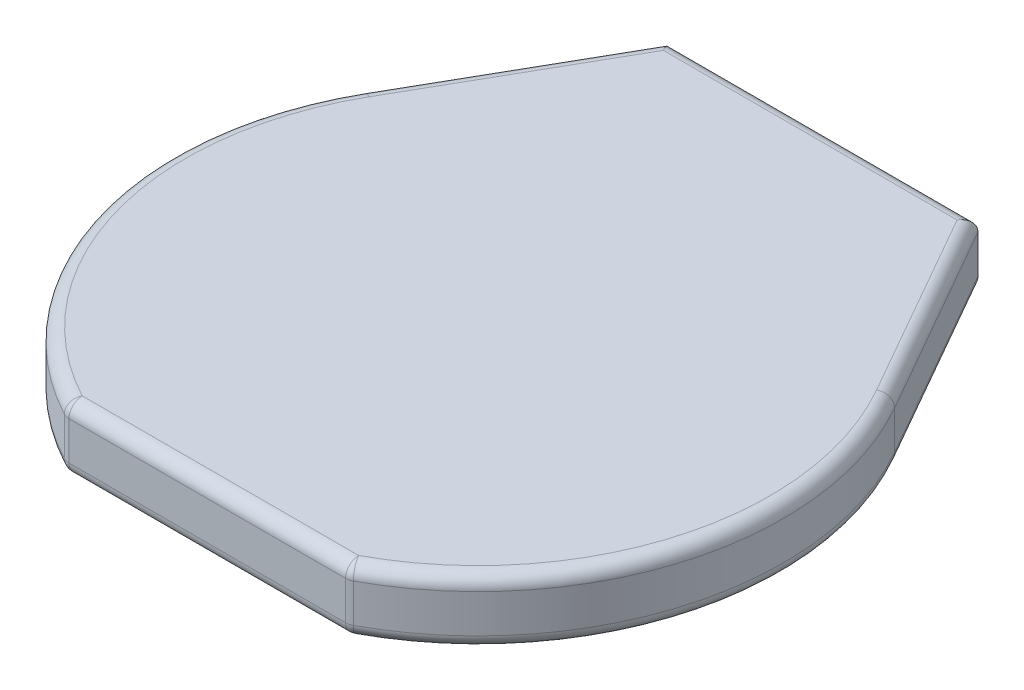
ISO-10303-21;
HEADER;
FILE_DESCRIPTION(('STEP AP214'),'2;1');
FILE_NAME('part.step','',(''),(''),'','','');
FILE_SCHEMA(('AUTOMOTIVE_DESIGN { 1 0 10303 214 1 1 1 1 }'));
ENDSEC;
DATA;
#1=APPLICATION_CONTEXT('core data for automotive mechanical design processes');
#2=APPLICATION_PROTOCOL_DEFINITION('international standard','automotive_design',2000,#1);
#3=PRODUCT_CONTEXT('',#1,'mechanical');
#4=PRODUCT('Part','Part','',(#3));
#5=PRODUCT_RELATED_PRODUCT_CATEGORY('part','',(#4));
#6=PRODUCT_DEFINITION_FORMATION('','',#4);
#7=PRODUCT_DEFINITION_CONTEXT('part definition',#1,'design');
#8=PRODUCT_DEFINITION('design','',#6,#7);
#9=PRODUCT_DEFINITION_SHAPE('','',#8);
#10=(LENGTH_UNIT() NAMED_UNIT(*) SI_UNIT(.MILLI.,.METRE.));
#11=(NAMED_UNIT(*) PLANE_ANGLE_UNIT() SI_UNIT($,.RADIAN.));
#12=(NAMED_UNIT(*) SI_UNIT($,.STERADIAN.) SOLID_ANGLE_UNIT());
#13=UNCERTAINTY_MEASURE_WITH_UNIT(LENGTH_MEASURE(1.E-05),#10,'distance_accuracy_value','');
#14=(GEOMETRIC_REPRESENTATION_CONTEXT(3) GLOBAL_UNCERTAINTY_ASSIGNED_CONTEXT((#13)) GLOBAL_UNIT_ASSIGNED_CONTEXT((#10,
#11,#12)) REPRESENTATION_CONTEXT('',''));
#15=CARTESIAN_POINT('',(0.,0.,0.));
#16=DIRECTION('',(0.,0.,1.));
#17=DIRECTION('',(1.,0.,0.));
#18=AXIS2_PLACEMENT_3D('',#15,#16,#17);
#19=CARTESIAN_POINT('',(0.,3.68,0.));
#20=DIRECTION('',(0.,-1.,0.));
#21=DIRECTION('',(0.,0.,-1.));
#22=AXIS2_PLACEMENT_3D('',#19,#20,#21);
#23=CYLINDRICAL_SURFACE('',#22,17.35);
#24=DIRECTION('',(0.,-1.,0.));
#25=VECTOR('',#24,1.);
#26=CARTESIAN_POINT('',(-15.0708365008925,3.68,-8.5960681223083));
#27=LINE('',#26,#25);
#28=CARTESIAN_POINT('',(-15.0708365008925,2.93,-8.5960681223083));
#29=VERTEX_POINT('',#28);
#30=CARTESIAN_POINT('',(-15.0708365008925,0.75,-8.5960681223083));
#31=VERTEX_POINT('',#30);
#32=EDGE_CURVE('E133',#29,#31,#27,.T.);
#33=ORIENTED_EDGE('',*,*,#32,.T.);
#34=CARTESIAN_POINT('',(0.,0.75,0.));
#35=DIRECTION('',(0.,1.,0.));
#36=DIRECTION('',(0.,0.,1.));
#37=AXIS2_PLACEMENT_3D('',#34,#35,#36);
#38=CIRCLE('',#37,17.35);
#39=CARTESIAN_POINT('',(-8.2084042192336,0.75,15.2854375198641));
#40=VERTEX_POINT('',#39);
#41=EDGE_CURVE('E50',#31,#40,#38,.T.);
#42=ORIENTED_EDGE('',*,*,#41,.T.);
#43=DIRECTION('',(0.,-1.,0.));
#44=VECTOR('',#43,1.);
#45=CARTESIAN_POINT('',(-8.2084042192336,3.68,15.2854375198641));
#46=LINE('',#45,#44);
#47=CARTESIAN_POINT('',(-8.2084042192336,2.93,15.2854375198641));
#48=VERTEX_POINT('',#47);
#49=EDGE_CURVE('E54',#40,#48,#46,.F.);
#50=ORIENTED_EDGE('',*,*,#49,.T.);
#51=CARTESIAN_POINT('',(0.,2.93,0.));
#52=DIRECTION('',(0.,1.,0.));
#53=DIRECTION('',(0.,0.,1.));
#54=AXIS2_PLACEMENT_3D('',#51,#52,#53);
#55=CIRCLE('',#54,17.35);
#56=EDGE_CURVE('E131',#48,#29,#55,.F.);
#57=ORIENTED_EDGE('',*,*,#56,.T.);
#58=EDGE_LOOP('',(#33,#42,#50,#57));
#59=FACE_BOUND('',#58,.T.);
#60=ADVANCED_FACE('F33',(#59),#23,.T.);
#61=CARTESIAN_POINT('',(-8.04,3.68,15.3746837365846));
#62=DIRECTION('',(0.,0.,-1.));
#63=DIRECTION('',(-1.,0.,0.));
#64=AXIS2_PLACEMENT_3D('',#61,#62,#63);
#65=PLANE('',#64);
#66=DIRECTION('',(0.,-1.,0.));
#67=VECTOR('',#66,1.);
#68=CARTESIAN_POINT('',(-7.85357406566442,3.68,15.3746837365846));
#69=LINE('',#68,#67);
#70=CARTESIAN_POINT('',(-7.85357406566442,2.93,15.3746837365846));
#71=VERTEX_POINT('',#70);
#72=CARTESIAN_POINT('',(-7.85357406566442,0.75,15.3746837365846));
#73=VERTEX_POINT('',#72);
#74=EDGE_CURVE('E205',#71,#73,#69,.T.);
#75=ORIENTED_EDGE('',*,*,#74,.T.);
#76=DIRECTION('',(1.,0.,0.));
#77=VECTOR('',#76,1.);
#78=CARTESIAN_POINT('',(-8.04,0.75,15.3746837365846));
#79=LINE('',#78,#77);
#80=CARTESIAN_POINT('',(7.85357406566442,0.75,15.3746837365846));
#81=VERTEX_POINT('',#80);
#82=EDGE_CURVE('E138',#73,#81,#79,.T.);
#83=ORIENTED_EDGE('',*,*,#82,.T.);
#84=DIRECTION('',(0.,-1.,0.));
#85=VECTOR('',#84,1.);
#86=CARTESIAN_POINT('',(7.85357406566442,3.68,15.3746837365846));
#87=LINE('',#86,#85);
#88=CARTESIAN_POINT('',(7.85357406566442,2.93,15.3746837365846));
#89=VERTEX_POINT('',#88);
#90=EDGE_CURVE('E199',#81,#89,#87,.F.);
#91=ORIENTED_EDGE('',*,*,#90,.T.);
#92=DIRECTION('',(1.,0.,0.));
#93=VECTOR('',#92,1.);
#94=CARTESIAN_POINT('',(-8.04,2.93,15.3746837365846));
#95=LINE('',#94,#93);
#96=EDGE_CURVE('E196',#89,#71,#95,.F.);
#97=ORIENTED_EDGE('',*,*,#96,.T.);
#98=EDGE_LOOP('',(#75,#83,#91,#97));
#99=FACE_BOUND('',#98,.T.);
#100=ADVANCED_FACE('F265',(#99),#65,.F.);
#101=CARTESIAN_POINT('',(0.,3.68,0.));
#102=DIRECTION('',(0.,-1.,0.));
#103=DIRECTION('',(0.,0.,-1.));
#104=AXIS2_PLACEMENT_3D('',#101,#102,#103);
#105=CYLINDRICAL_SURFACE('',#104,17.35);
#106=DIRECTION('',(0.,-1.,0.));
#107=VECTOR('',#106,1.);
#108=CARTESIAN_POINT('',(8.2084042192336,3.68,15.2854375198641));
#109=LINE('',#108,#107);
#110=CARTESIAN_POINT('',(8.2084042192336,2.93,15.2854375198641));
#111=VERTEX_POINT('',#110);
#112=CARTESIAN_POINT('',(8.2084042192336,0.75,15.2854375198641));
#113=VERTEX_POINT('',#112);
#114=EDGE_CURVE('E254',#111,#113,#109,.T.);
#115=ORIENTED_EDGE('',*,*,#114,.T.);
#116=CARTESIAN_POINT('',(0.,0.75,0.));
#117=DIRECTION('',(0.,1.,0.));
#118=DIRECTION('',(0.,0.,1.));
#119=AXIS2_PLACEMENT_3D('',#116,#117,#118);
#120=CIRCLE('',#119,17.35);
#121=CARTESIAN_POINT('',(15.0708365008925,0.75,-8.5960681223083));
#122=VERTEX_POINT('',#121);
#123=EDGE_CURVE('E282',#113,#122,#120,.T.);
#124=ORIENTED_EDGE('',*,*,#123,.T.);
#125=DIRECTION('',(0.,-1.,0.));
#126=VECTOR('',#125,1.);
#127=CARTESIAN_POINT('',(15.0708365008925,3.68,-8.5960681223083));
#128=LINE('',#127,#126);
#129=CARTESIAN_POINT('',(15.0708365008925,2.93,-8.5960681223083));
#130=VERTEX_POINT('',#129);
#131=EDGE_CURVE('E160',#130,#122,#128,.T.);
#132=ORIENTED_EDGE('',*,*,#131,.F.);
#133=CARTESIAN_POINT('',(0.,2.93,0.));
#134=DIRECTION('',(0.,1.,0.));
#135=DIRECTION('',(0.,0.,1.));
#136=AXIS2_PLACEMENT_3D('',#133,#134,#135);
#137=CIRCLE('',#136,17.35);
#138=EDGE_CURVE('E290',#130,#111,#137,.F.);
#139=ORIENTED_EDGE('',*,*,#138,.T.);
#140=EDGE_LOOP('',(#115,#124,#132,#139));
#141=FACE_BOUND('',#140,.T.);
#142=ADVANCED_FACE('F352',(#141),#105,.T.);
#143=CARTESIAN_POINT('',(8.78,3.68,-19.6253162634154));
#144=DIRECTION('',(-0.86863610956153,0.,0.49545061223679));
#145=DIRECTION('',(0.49545061223679,0.,0.86863610956153));
#146=AXIS2_PLACEMENT_3D('',#143,#144,#145);
#147=PLANE('',#146);
#148=DIRECTION('',(0.,-1.,0.));
#149=VECTOR('',#148,1.);
#150=CARTESIAN_POINT('',(8.78,3.68,-19.6253162634154));
#151=LINE('',#150,#149);
#152=CARTESIAN_POINT('',(8.78,2.93,-19.6253162634154));
#153=VERTEX_POINT('',#152);
#154=CARTESIAN_POINT('',(8.78,0.75,-19.6253162634154));
#155=VERTEX_POINT('',#154);
#156=EDGE_CURVE('E316',#153,#155,#151,.T.);
#157=ORIENTED_EDGE('',*,*,#156,.F.);
#158=DIRECTION('',(-0.49545061223679,0.,-0.86863610956153));
#159=VECTOR('',#158,1.);
#160=CARTESIAN_POINT('',(15.0708365008925,2.93,-8.5960681223083));
#161=LINE('',#160,#159);
#162=EDGE_CURVE('E191',#153,#130,#161,.F.);
#163=ORIENTED_EDGE('',*,*,#162,.T.);
#164=ORIENTED_EDGE('',*,*,#131,.T.);
#165=DIRECTION('',(-0.49545061223679,0.,-0.86863610956153));
#166=VECTOR('',#165,1.);
#167=CARTESIAN_POINT('',(8.78,0.75,-19.6253162634154));
#168=LINE('',#167,#166);
#169=EDGE_CURVE('E197',#122,#155,#168,.T.);
#170=ORIENTED_EDGE('',*,*,#169,.T.);
#171=EDGE_LOOP('',(#157,#163,#164,#170));
#172=FACE_BOUND('',#171,.T.);
#173=ADVANCED_FACE('F513',(#172),#147,.F.);
#174=CARTESIAN_POINT('',(-8.78,3.68,-19.6253162634154));
#175=DIRECTION('',(0.,0.,1.));
#176=DIRECTION('',(1.,0.,0.));
#177=AXIS2_PLACEMENT_3D('',#174,#175,#176);
#178=PLANE('',#177);
#179=ORIENTED_EDGE('',*,*,#156,.T.);
#180=DIRECTION('',(-1.,0.,0.));
#181=VECTOR('',#180,1.);
#182=CARTESIAN_POINT('',(-8.78,0.75,-19.6253162634154));
#183=LINE('',#182,#181);
#184=CARTESIAN_POINT('',(-8.78,0.75,-19.6253162634154));
#185=VERTEX_POINT('',#184);
#186=EDGE_CURVE('E11',#155,#185,#183,.T.);
#187=ORIENTED_EDGE('',*,*,#186,.T.);
#188=DIRECTION('',(0.,-1.,0.));
#189=VECTOR('',#188,1.);
#190=CARTESIAN_POINT('',(-8.78,3.68,-19.6253162634154));
#191=LINE('',#190,#189);
#192=CARTESIAN_POINT('',(-8.78,2.93,-19.6253162634154));
#193=VERTEX_POINT('',#192);
#194=EDGE_CURVE('E149',#193,#185,#191,.T.);
#195=ORIENTED_EDGE('',*,*,#194,.F.);
#196=DIRECTION('',(-1.,0.,0.));
#197=VECTOR('',#196,1.);
#198=CARTESIAN_POINT('',(8.78,2.93,-19.6253162634154));
#199=LINE('',#198,#197);
#200=EDGE_CURVE('E42',#193,#153,#199,.F.);
#201=ORIENTED_EDGE('',*,*,#200,.T.);
#202=EDGE_LOOP('',(#179,#187,#195,#201));
#203=FACE_BOUND('',#202,.T.);
#204=ADVANCED_FACE('F505',(#203),#178,.F.);
#205=CARTESIAN_POINT('',(-8.78,3.68,-19.6253162634154));
#206=DIRECTION('',(0.86863610956153,0.,0.49545061223679));
#207=DIRECTION('',(0.49545061223679,0.,-0.86863610956153));
#208=AXIS2_PLACEMENT_3D('',#205,#206,#207);
#209=PLANE('',#208);
#210=ORIENTED_EDGE('',*,*,#194,.T.);
#211=DIRECTION('',(-0.49545061223679,0.,0.86863610956153));
#212=VECTOR('',#211,1.);
#213=CARTESIAN_POINT('',(-8.78,0.75,-19.6253162634154));
#214=LINE('',#213,#212);
#215=EDGE_CURVE('E148',#185,#31,#214,.T.);
#216=ORIENTED_EDGE('',*,*,#215,.T.);
#217=ORIENTED_EDGE('',*,*,#32,.F.);
#218=DIRECTION('',(-0.49545061223679,0.,0.86863610956153));
#219=VECTOR('',#218,1.);
#220=CARTESIAN_POINT('',(-8.78,2.93,-19.6253162634154));
#221=LINE('',#220,#219);
#222=EDGE_CURVE('E145',#29,#193,#221,.F.);
#223=ORIENTED_EDGE('',*,*,#222,.T.);
#224=EDGE_LOOP('',(#210,#216,#217,#223));
#225=FACE_BOUND('',#224,.T.);
#226=ADVANCED_FACE('F144',(#225),#209,.F.);
#227=CARTESIAN_POINT('',(0.,3.68,0.));
#228=DIRECTION('',(0.,1.,0.));
#229=DIRECTION('',(0.,0.,1.));
#230=AXIS2_PLACEMENT_3D('',#227,#228,#229);
#231=PLANE('',#230);
#232=DIRECTION('',(-0.49545061223679,0.,-0.86863610956153));
#233=VECTOR('',#232,1.);
#234=CARTESIAN_POINT('',(8.12852291782885,3.68,-19.2537283042378));
#235=LINE('',#234,#233);
#236=CARTESIAN_POINT('',(14.4193594187214,3.68,-8.22448016313071));
#237=VERTEX_POINT('',#236);
#238=CARTESIAN_POINT('',(8.34436068376961,3.68,-18.8753162634154));
#239=VERTEX_POINT('',#238);
#240=EDGE_CURVE('E190',#237,#239,#235,.T.);
#241=ORIENTED_EDGE('',*,*,#240,.T.);
#242=DIRECTION('',(-1.,0.,0.));
#243=VECTOR('',#242,1.);
#244=CARTESIAN_POINT('',(-8.78,3.68,-18.8753162634154));
#245=LINE('',#244,#243);
#246=CARTESIAN_POINT('',(-8.34436068376961,3.68,-18.8753162634154));
#247=VERTEX_POINT('',#246);
#248=EDGE_CURVE('E186',#239,#247,#245,.T.);
#249=ORIENTED_EDGE('',*,*,#248,.T.);
#250=DIRECTION('',(-0.49545061223679,0.,0.86863610956153));
#251=VECTOR('',#250,1.);
#252=CARTESIAN_POINT('',(-14.4193594187214,3.68,-8.22448016313071));
#253=LINE('',#252,#251);
#254=CARTESIAN_POINT('',(-14.4193594187214,3.68,-8.22448016313071));
#255=VERTEX_POINT('',#254);
#256=EDGE_CURVE('E297',#247,#255,#253,.T.);
#257=ORIENTED_EDGE('',*,*,#256,.T.);
#258=CARTESIAN_POINT('',(0.,3.68,0.));
#259=DIRECTION('',(0.,1.,0.));
#260=DIRECTION('',(0.,0.,1.));
#261=AXIS2_PLACEMENT_3D('',#258,#259,#260);
#262=CIRCLE('',#261,16.6);
#263=CARTESIAN_POINT('',(-7.85357406566443,3.68,14.6246837365846));
#264=VERTEX_POINT('',#263);
#265=EDGE_CURVE('E163',#255,#264,#262,.T.);
#266=ORIENTED_EDGE('',*,*,#265,.T.);
#267=DIRECTION('',(1.,0.,0.));
#268=VECTOR('',#267,1.);
#269=CARTESIAN_POINT('',(8.04,3.68,14.6246837365846));
#270=LINE('',#269,#268);
#271=CARTESIAN_POINT('',(7.85357406566443,3.68,14.6246837365846));
#272=VERTEX_POINT('',#271);
#273=EDGE_CURVE('E288',#264,#272,#270,.T.);
#274=ORIENTED_EDGE('',*,*,#273,.T.);
#275=CARTESIAN_POINT('',(0.,3.68,0.));
#276=DIRECTION('',(0.,1.,0.));
#277=DIRECTION('',(0.,0.,1.));
#278=AXIS2_PLACEMENT_3D('',#275,#276,#277);
#279=CIRCLE('',#278,16.6);
#280=EDGE_CURVE('E286',#272,#237,#279,.T.);
#281=ORIENTED_EDGE('',*,*,#280,.T.);
#282=EDGE_LOOP('',(#241,#249,#257,#266,#274,#281));
#283=FACE_BOUND('',#282,.T.);
#284=ADVANCED_FACE('F299',(#283),#231,.T.);
#285=CARTESIAN_POINT('',(0.,0.,0.));
#286=DIRECTION('',(0.,1.,0.));
#287=DIRECTION('',(0.,0.,1.));
#288=AXIS2_PLACEMENT_3D('',#285,#286,#287);
#289=PLANE('',#288);
#290=DIRECTION('',(1.,0.,0.));
#291=VECTOR('',#290,1.);
#292=CARTESIAN_POINT('',(0.,0.,14.6246837365846));
#293=LINE('',#292,#291);
#294=CARTESIAN_POINT('',(7.85357406566443,0.,14.6246837365846));
#295=VERTEX_POINT('',#294);
#296=CARTESIAN_POINT('',(-7.85357406566443,0.,14.6246837365846));
#297=VERTEX_POINT('',#296);
#298=EDGE_CURVE('E274',#295,#297,#293,.F.);
#299=ORIENTED_EDGE('',*,*,#298,.T.);
#300=CARTESIAN_POINT('',(0.,0.,0.));
#301=DIRECTION('',(0.,1.,0.));
#302=DIRECTION('',(0.,0.,1.));
#303=AXIS2_PLACEMENT_3D('',#300,#301,#302);
#304=CIRCLE('',#303,16.6);
#305=CARTESIAN_POINT('',(-14.4193594187214,0.,-8.22448016313071));
#306=VERTEX_POINT('',#305);
#307=EDGE_CURVE('E301',#297,#306,#304,.F.);
#308=ORIENTED_EDGE('',*,*,#307,.T.);
#309=DIRECTION('',(-0.49545061223679,0.,0.86863610956153));
#310=VECTOR('',#309,1.);
#311=CARTESIAN_POINT('',(-14.4193594187214,0.,-8.22448016313071));
#312=LINE('',#311,#310);
#313=CARTESIAN_POINT('',(-8.34436068376961,0.,-18.8753162634154));
#314=VERTEX_POINT('',#313);
#315=EDGE_CURVE('E305',#306,#314,#312,.F.);
#316=ORIENTED_EDGE('',*,*,#315,.T.);
#317=DIRECTION('',(-1.,0.,0.));
#318=VECTOR('',#317,1.);
#319=CARTESIAN_POINT('',(0.,0.,-18.8753162634154));
#320=LINE('',#319,#318);
#321=CARTESIAN_POINT('',(8.34436068376961,0.,-18.8753162634154));
#322=VERTEX_POINT('',#321);
#323=EDGE_CURVE('E310',#314,#322,#320,.F.);
#324=ORIENTED_EDGE('',*,*,#323,.T.);
#325=DIRECTION('',(-0.49545061223679,0.,-0.86863610956153));
#326=VECTOR('',#325,1.);
#327=CARTESIAN_POINT('',(14.4193594187214,0.,-8.2244801631307));
#328=LINE('',#327,#326);
#329=CARTESIAN_POINT('',(14.4193594187214,0.,-8.22448016313071));
#330=VERTEX_POINT('',#329);
#331=EDGE_CURVE('E312',#322,#330,#328,.F.);
#332=ORIENTED_EDGE('',*,*,#331,.T.);
#333=CARTESIAN_POINT('',(0.,0.,0.));
#334=DIRECTION('',(0.,1.,0.));
#335=DIRECTION('',(0.,0.,1.));
#336=AXIS2_PLACEMENT_3D('',#333,#334,#335);
#337=CIRCLE('',#336,16.6);
#338=EDGE_CURVE('E308',#330,#295,#337,.F.);
#339=ORIENTED_EDGE('',*,*,#338,.T.);
#340=EDGE_LOOP('',(#299,#308,#316,#324,#332,#339));
#341=FACE_BOUND('',#340,.T.);
#342=ADVANCED_FACE('F483',(#341),#289,.F.);
#343=CARTESIAN_POINT('',(14.4193594187214,2.93,-8.22448016313071));
#344=DIRECTION('',(0.49545061223679,0.,0.86863610956153));
#345=DIRECTION('',(0.86863610956153,0.,-0.49545061223679));
#346=AXIS2_PLACEMENT_3D('',#343,#344,#345);
#347=CYLINDRICAL_SURFACE('',#346,0.75);
#348=CARTESIAN_POINT('',(14.4193594187214,2.93,-8.22448016313071));
#349=DIRECTION('',(0.49545061223679,0.,0.86863610956153));
#350=DIRECTION('',(0.86863610956153,0.,-0.49545061223679));
#351=AXIS2_PLACEMENT_3D('',#348,#349,#350);
#352=CIRCLE('',#351,0.75);
#353=EDGE_CURVE('E174',#130,#237,#352,.T.);
#354=ORIENTED_EDGE('',*,*,#353,.F.);
#355=ORIENTED_EDGE('',*,*,#162,.F.);
#356=CARTESIAN_POINT('',(8.34436068376961,2.93,-18.8753162634154));
#357=DIRECTION('',(0.864711111365174,0.,0.502269543055923));
#358=DIRECTION('',(0.502269543055922,0.,-0.864711111365174));
#359=AXIS2_PLACEMENT_3D('',#356,#357,#358);
#360=ELLIPSE('',#359,0.867341693824111,0.75);
#361=EDGE_CURVE('E37',#239,#153,#360,.F.);
#362=ORIENTED_EDGE('',*,*,#361,.F.);
#363=ORIENTED_EDGE('',*,*,#240,.F.);
#364=EDGE_LOOP('',(#354,#355,#362,#363));
#365=FACE_BOUND('',#364,.T.);
#366=ADVANCED_FACE('F35',(#365),#347,.T.);
#367=CARTESIAN_POINT('',(0.,2.93,-18.8753162634154));
#368=DIRECTION('',(1.,0.,0.));
#369=DIRECTION('',(0.,0.,-1.));
#370=AXIS2_PLACEMENT_3D('',#367,#368,#369);
#371=CYLINDRICAL_SURFACE('',#370,0.75);
#372=ORIENTED_EDGE('',*,*,#361,.T.);
#373=ORIENTED_EDGE('',*,*,#200,.F.);
#374=CARTESIAN_POINT('',(-8.34436068376961,2.93,-18.8753162634154));
#375=DIRECTION('',(0.864711111365174,0.,-0.502269543055923));
#376=DIRECTION('',(0.502269543055922,0.,0.864711111365174));
#377=AXIS2_PLACEMENT_3D('',#374,#375,#376);
#378=ELLIPSE('',#377,0.867341693824111,0.75);
#379=EDGE_CURVE('E159',#247,#193,#378,.F.);
#380=ORIENTED_EDGE('',*,*,#379,.F.);
#381=ORIENTED_EDGE('',*,*,#248,.F.);
#382=EDGE_LOOP('',(#372,#373,#380,#381));
#383=FACE_BOUND('',#382,.T.);
#384=ADVANCED_FACE('F185',(#383),#371,.T.);
#385=CARTESIAN_POINT('',(0.,2.93,0.));
#386=DIRECTION('',(0.,1.,0.));
#387=DIRECTION('',(0.,0.,1.));
#388=AXIS2_PLACEMENT_3D('',#385,#386,#387);
#389=TOROIDAL_SURFACE('',#388,16.6,0.75);
#390=ORIENTED_EDGE('',*,*,#353,.T.);
#391=ORIENTED_EDGE('',*,*,#280,.F.);
#392=CARTESIAN_POINT('',(7.85357406566442,2.93,14.6246837365846));
#393=DIRECTION('',(-0.881005044372569,0.,0.473106871425567));
#394=DIRECTION('',(0.473106871425567,0.,0.881005044372569));
#395=AXIS2_PLACEMENT_3D('',#392,#393,#394);
#396=CIRCLE('',#395,0.75);
#397=EDGE_CURVE('E164',#111,#272,#396,.T.);
#398=ORIENTED_EDGE('',*,*,#397,.F.);
#399=ORIENTED_EDGE('',*,*,#138,.F.);
#400=EDGE_LOOP('',(#390,#391,#398,#399));
#401=FACE_BOUND('',#400,.T.);
#402=ADVANCED_FACE('F300',(#401),#389,.T.);
#403=CARTESIAN_POINT('',(-14.4193594187214,2.93,-8.22448016313071));
#404=DIRECTION('',(0.49545061223679,0.,-0.86863610956153));
#405=DIRECTION('',(-0.86863610956153,0.,-0.49545061223679));
#406=AXIS2_PLACEMENT_3D('',#403,#404,#405);
#407=CYLINDRICAL_SURFACE('',#406,0.75);
#408=ORIENTED_EDGE('',*,*,#379,.T.);
#409=ORIENTED_EDGE('',*,*,#222,.F.);
#410=CARTESIAN_POINT('',(-14.4193594187214,2.93,-8.22448016313071));
#411=DIRECTION('',(-0.49545061223679,0.,0.86863610956153));
#412=DIRECTION('',(0.86863610956153,0.,0.49545061223679));
#413=AXIS2_PLACEMENT_3D('',#410,#411,#412);
#414=CIRCLE('',#413,0.75);
#415=EDGE_CURVE('E156',#255,#29,#414,.T.);
#416=ORIENTED_EDGE('',*,*,#415,.F.);
#417=ORIENTED_EDGE('',*,*,#256,.F.);
#418=EDGE_LOOP('',(#408,#409,#416,#417));
#419=FACE_BOUND('',#418,.T.);
#420=ADVANCED_FACE('F154',(#419),#407,.T.);
#421=CARTESIAN_POINT('',(7.85357406566443,2.93,14.6246837365846));
#422=DIRECTION('',(0.,0.,1.));
#423=DIRECTION('',(1.,0.,0.));
#424=AXIS2_PLACEMENT_3D('',#421,#422,#423);
#425=SPHERICAL_SURFACE('',#424,0.75);
#426=CARTESIAN_POINT('',(7.85357406566442,2.93,14.6246837365846));
#427=DIRECTION('',(0.,1.,0.));
#428=DIRECTION('',(0.,0.,1.));
#429=AXIS2_PLACEMENT_3D('',#426,#427,#428);
#430=CIRCLE('',#429,0.75);
#431=EDGE_CURVE('E170',#111,#89,#430,.F.);
#432=ORIENTED_EDGE('',*,*,#431,.F.);
#433=ORIENTED_EDGE('',*,*,#397,.T.);
#434=CARTESIAN_POINT('',(7.85357406566443,2.93,14.6246837365846));
#435=DIRECTION('',(1.,0.,0.));
#436=DIRECTION('',(0.,0.,-1.));
#437=AXIS2_PLACEMENT_3D('',#434,#435,#436);
#438=CIRCLE('',#437,0.75);
#439=EDGE_CURVE('E165',#89,#272,#438,.F.);
#440=ORIENTED_EDGE('',*,*,#439,.F.);
#441=EDGE_LOOP('',(#432,#433,#440));
#442=FACE_BOUND('',#441,.T.);
#443=ADVANCED_FACE('F257',(#442),#425,.T.);
#444=CARTESIAN_POINT('',(0.,2.93,0.));
#445=DIRECTION('',(0.,1.,0.));
#446=DIRECTION('',(0.,0.,1.));
#447=AXIS2_PLACEMENT_3D('',#444,#445,#446);
#448=TOROIDAL_SURFACE('',#447,16.6,0.75);
#449=ORIENTED_EDGE('',*,*,#415,.T.);
#450=ORIENTED_EDGE('',*,*,#56,.F.);
#451=CARTESIAN_POINT('',(-7.85357406566443,2.93,14.6246837365846));
#452=DIRECTION('',(0.881005044372573,0.,0.473106871425558));
#453=DIRECTION('',(0.473106871425558,0.,-0.881005044372574));
#454=AXIS2_PLACEMENT_3D('',#451,#452,#453);
#455=CIRCLE('',#454,0.75);
#456=EDGE_CURVE('E245',#264,#48,#455,.T.);
#457=ORIENTED_EDGE('',*,*,#456,.F.);
#458=ORIENTED_EDGE('',*,*,#265,.F.);
#459=EDGE_LOOP('',(#449,#450,#457,#458));
#460=FACE_BOUND('',#459,.T.);
#461=ADVANCED_FACE('F162',(#460),#448,.T.);
#462=CARTESIAN_POINT('',(0.,2.93,14.6246837365846));
#463=DIRECTION('',(-1.,0.,0.));
#464=DIRECTION('',(0.,0.,1.));
#465=AXIS2_PLACEMENT_3D('',#462,#463,#464);
#466=CYLINDRICAL_SURFACE('',#465,0.75);
#467=ORIENTED_EDGE('',*,*,#439,.T.);
#468=ORIENTED_EDGE('',*,*,#273,.F.);
#469=CARTESIAN_POINT('',(-7.85357406566442,2.93,14.6246837365846));
#470=DIRECTION('',(-1.,0.,0.));
#471=DIRECTION('',(0.,-1.,0.));
#472=AXIS2_PLACEMENT_3D('',#469,#470,#471);
#473=CIRCLE('',#472,0.75);
#474=EDGE_CURVE('E242',#71,#264,#473,.T.);
#475=ORIENTED_EDGE('',*,*,#474,.F.);
#476=ORIENTED_EDGE('',*,*,#96,.F.);
#477=EDGE_LOOP('',(#467,#468,#475,#476));
#478=FACE_BOUND('',#477,.T.);
#479=ADVANCED_FACE('F262',(#478),#466,.T.);
#480=CARTESIAN_POINT('',(7.85357406566442,3.68,14.6246837365846));
#481=DIRECTION('',(0.,-1.,0.));
#482=DIRECTION('',(0.,0.,-1.));
#483=AXIS2_PLACEMENT_3D('',#480,#481,#482);
#484=CYLINDRICAL_SURFACE('',#483,0.75);
#485=ORIENTED_EDGE('',*,*,#431,.T.);
#486=ORIENTED_EDGE('',*,*,#90,.F.);
#487=CARTESIAN_POINT('',(7.85357406566442,0.75,14.6246837365846));
#488=DIRECTION('',(0.,-1.,0.));
#489=DIRECTION('',(0.,0.,-1.));
#490=AXIS2_PLACEMENT_3D('',#487,#488,#489);
#491=CIRCLE('',#490,0.75);
#492=EDGE_CURVE('E239',#113,#81,#491,.T.);
#493=ORIENTED_EDGE('',*,*,#492,.F.);
#494=ORIENTED_EDGE('',*,*,#114,.F.);
#495=EDGE_LOOP('',(#485,#486,#493,#494));
#496=FACE_BOUND('',#495,.T.);
#497=ADVANCED_FACE('F252',(#496),#484,.T.);
#498=CARTESIAN_POINT('',(-7.85357406566442,2.93,14.6246837365846));
#499=DIRECTION('',(0.,0.,1.));
#500=DIRECTION('',(1.,0.,0.));
#501=AXIS2_PLACEMENT_3D('',#498,#499,#500);
#502=SPHERICAL_SURFACE('',#501,0.75);
#503=ORIENTED_EDGE('',*,*,#474,.T.);
#504=ORIENTED_EDGE('',*,*,#456,.T.);
#505=CARTESIAN_POINT('',(-7.85357406566442,2.93,14.6246837365846));
#506=DIRECTION('',(0.,1.,0.));
#507=DIRECTION('',(0.,0.,1.));
#508=AXIS2_PLACEMENT_3D('',#505,#506,#507);
#509=CIRCLE('',#508,0.75);
#510=EDGE_CURVE('E233',#71,#48,#509,.F.);
#511=ORIENTED_EDGE('',*,*,#510,.F.);
#512=EDGE_LOOP('',(#503,#504,#511));
#513=FACE_BOUND('',#512,.T.);
#514=ADVANCED_FACE('F338',(#513),#502,.T.);
#515=CARTESIAN_POINT('',(7.85357406566442,0.75,14.6246837365846));
#516=DIRECTION('',(0.,0.,1.));
#517=DIRECTION('',(1.,0.,0.));
#518=AXIS2_PLACEMENT_3D('',#515,#516,#517);
#519=SPHERICAL_SURFACE('',#518,0.75);
#520=CARTESIAN_POINT('',(7.85357406566442,0.75,14.6246837365846));
#521=DIRECTION('',(1.,0.,0.));
#522=DIRECTION('',(0.,1.,0.));
#523=AXIS2_PLACEMENT_3D('',#520,#521,#522);
#524=CIRCLE('',#523,0.75);
#525=EDGE_CURVE('E230',#295,#81,#524,.F.);
#526=ORIENTED_EDGE('',*,*,#525,.F.);
#527=CARTESIAN_POINT('',(7.85357406566443,0.75,14.6246837365846));
#528=DIRECTION('',(-0.881005044372574,0.,0.473106871425558));
#529=DIRECTION('',(0.473106871425558,0.,0.881005044372574));
#530=AXIS2_PLACEMENT_3D('',#527,#528,#529);
#531=CIRCLE('',#530,0.75);
#532=EDGE_CURVE('E236',#113,#295,#531,.F.);
#533=ORIENTED_EDGE('',*,*,#532,.F.);
#534=ORIENTED_EDGE('',*,*,#492,.T.);
#535=EDGE_LOOP('',(#526,#533,#534));
#536=FACE_BOUND('',#535,.T.);
#537=ADVANCED_FACE('F277',(#536),#519,.T.);
#538=CARTESIAN_POINT('',(0.,0.75,0.));
#539=DIRECTION('',(0.,1.,0.));
#540=DIRECTION('',(0.,0.,1.));
#541=AXIS2_PLACEMENT_3D('',#538,#539,#540);
#542=TOROIDAL_SURFACE('',#541,16.6,0.75);
#543=ORIENTED_EDGE('',*,*,#532,.T.);
#544=ORIENTED_EDGE('',*,*,#338,.F.);
#545=CARTESIAN_POINT('',(14.4193594187214,0.75,-8.22448016313071));
#546=DIRECTION('',(-0.49545061223679,0.,-0.86863610956153));
#547=DIRECTION('',(-0.86863610956153,0.,0.49545061223679));
#548=AXIS2_PLACEMENT_3D('',#545,#546,#547);
#549=CIRCLE('',#548,0.75);
#550=EDGE_CURVE('E227',#122,#330,#549,.T.);
#551=ORIENTED_EDGE('',*,*,#550,.F.);
#552=ORIENTED_EDGE('',*,*,#123,.F.);
#553=EDGE_LOOP('',(#543,#544,#551,#552));
#554=FACE_BOUND('',#553,.T.);
#555=ADVANCED_FACE('F283',(#554),#542,.T.);
#556=CARTESIAN_POINT('',(-7.85357406566442,3.68,14.6246837365846));
#557=DIRECTION('',(0.,-1.,0.));
#558=DIRECTION('',(0.,0.,-1.));
#559=AXIS2_PLACEMENT_3D('',#556,#557,#558);
#560=CYLINDRICAL_SURFACE('',#559,0.75);
#561=ORIENTED_EDGE('',*,*,#510,.T.);
#562=ORIENTED_EDGE('',*,*,#49,.F.);
#563=CARTESIAN_POINT('',(-7.85357406566442,0.75,14.6246837365846));
#564=DIRECTION('',(0.,-1.,0.));
#565=DIRECTION('',(0.,0.,-1.));
#566=AXIS2_PLACEMENT_3D('',#563,#564,#565);
#567=CIRCLE('',#566,0.75);
#568=EDGE_CURVE('E224',#73,#40,#567,.T.);
#569=ORIENTED_EDGE('',*,*,#568,.F.);
#570=ORIENTED_EDGE('',*,*,#74,.F.);
#571=EDGE_LOOP('',(#561,#562,#569,#570));
#572=FACE_BOUND('',#571,.T.);
#573=ADVANCED_FACE('F336',(#572),#560,.T.);
#574=CARTESIAN_POINT('',(-8.04,0.75,14.6246837365846));
#575=DIRECTION('',(1.,0.,0.));
#576=DIRECTION('',(0.,0.,-1.));
#577=AXIS2_PLACEMENT_3D('',#574,#575,#576);
#578=CYLINDRICAL_SURFACE('',#577,0.75);
#579=ORIENTED_EDGE('',*,*,#525,.T.);
#580=ORIENTED_EDGE('',*,*,#82,.F.);
#581=CARTESIAN_POINT('',(-7.85357406566443,0.75,14.6246837365846));
#582=DIRECTION('',(-1.,0.,0.));
#583=DIRECTION('',(0.,0.,1.));
#584=AXIS2_PLACEMENT_3D('',#581,#582,#583);
#585=CIRCLE('',#584,0.75);
#586=EDGE_CURVE('E222',#297,#73,#585,.T.);
#587=ORIENTED_EDGE('',*,*,#586,.F.);
#588=ORIENTED_EDGE('',*,*,#298,.F.);
#589=EDGE_LOOP('',(#579,#580,#587,#588));
#590=FACE_BOUND('',#589,.T.);
#591=ADVANCED_FACE('F270',(#590),#578,.T.);
#592=CARTESIAN_POINT('',(8.12852291782885,0.75,-19.2537283042378));
#593=DIRECTION('',(-0.49545061223679,0.,-0.86863610956153));
#594=DIRECTION('',(-0.86863610956153,0.,0.49545061223679));
#595=AXIS2_PLACEMENT_3D('',#592,#593,#594);
#596=CYLINDRICAL_SURFACE('',#595,0.75);
#597=ORIENTED_EDGE('',*,*,#550,.T.);
#598=ORIENTED_EDGE('',*,*,#331,.F.);
#599=CARTESIAN_POINT('',(8.34436068376962,0.75,-18.8753162634154));
#600=DIRECTION('',(-0.864711111365174,0.,-0.502269543055923));
#601=DIRECTION('',(0.502269543055922,0.,-0.864711111365174));
#602=AXIS2_PLACEMENT_3D('',#599,#600,#601);
#603=ELLIPSE('',#602,0.867341693824111,0.75);
#604=EDGE_CURVE('E219',#155,#322,#603,.T.);
#605=ORIENTED_EDGE('',*,*,#604,.F.);
#606=ORIENTED_EDGE('',*,*,#169,.F.);
#607=EDGE_LOOP('',(#597,#598,#605,#606));
#608=FACE_BOUND('',#607,.T.);
#609=ADVANCED_FACE('F364',(#608),#596,.T.);
#610=CARTESIAN_POINT('',(-7.85357406566443,0.75,14.6246837365846));
#611=DIRECTION('',(0.,0.,1.));
#612=DIRECTION('',(1.,0.,0.));
#613=AXIS2_PLACEMENT_3D('',#610,#611,#612);
#614=SPHERICAL_SURFACE('',#613,0.75);
#615=ORIENTED_EDGE('',*,*,#586,.T.);
#616=ORIENTED_EDGE('',*,*,#568,.T.);
#617=CARTESIAN_POINT('',(-7.85357406566442,0.75,14.6246837365846));
#618=DIRECTION('',(0.881005044372569,0.,0.473106871425567));
#619=DIRECTION('',(0.473106871425567,0.,-0.881005044372569));
#620=AXIS2_PLACEMENT_3D('',#617,#618,#619);
#621=CIRCLE('',#620,0.75);
#622=EDGE_CURVE('E216',#297,#40,#621,.F.);
#623=ORIENTED_EDGE('',*,*,#622,.F.);
#624=EDGE_LOOP('',(#615,#616,#623));
#625=FACE_BOUND('',#624,.T.);
#626=ADVANCED_FACE('F333',(#625),#614,.T.);
#627=CARTESIAN_POINT('',(-8.78,0.75,-18.8753162634154));
#628=DIRECTION('',(-1.,0.,0.));
#629=DIRECTION('',(0.,0.,1.));
#630=AXIS2_PLACEMENT_3D('',#627,#628,#629);
#631=CYLINDRICAL_SURFACE('',#630,0.75);
#632=ORIENTED_EDGE('',*,*,#604,.T.);
#633=ORIENTED_EDGE('',*,*,#323,.F.);
#634=CARTESIAN_POINT('',(-8.34436068376961,0.75,-18.8753162634154));
#635=DIRECTION('',(-0.864711111365174,0.,0.502269543055923));
#636=DIRECTION('',(-0.502269543055922,0.,-0.864711111365174));
#637=AXIS2_PLACEMENT_3D('',#634,#635,#636);
#638=ELLIPSE('',#637,0.867341693824111,0.75);
#639=EDGE_CURVE('E214',#185,#314,#638,.T.);
#640=ORIENTED_EDGE('',*,*,#639,.F.);
#641=ORIENTED_EDGE('',*,*,#186,.F.);
#642=EDGE_LOOP('',(#632,#633,#640,#641));
#643=FACE_BOUND('',#642,.T.);
#644=ADVANCED_FACE('F324',(#643),#631,.T.);
#645=CARTESIAN_POINT('',(0.,0.75,0.));
#646=DIRECTION('',(0.,1.,0.));
#647=DIRECTION('',(0.,0.,1.));
#648=AXIS2_PLACEMENT_3D('',#645,#646,#647);
#649=TOROIDAL_SURFACE('',#648,16.6,0.75);
#650=ORIENTED_EDGE('',*,*,#622,.T.);
#651=ORIENTED_EDGE('',*,*,#41,.F.);
#652=CARTESIAN_POINT('',(-14.4193594187214,0.75,-8.22448016313071));
#653=DIRECTION('',(0.49545061223679,0.,-0.86863610956153));
#654=DIRECTION('',(-0.86863610956153,0.,-0.49545061223679));
#655=AXIS2_PLACEMENT_3D('',#652,#653,#654);
#656=CIRCLE('',#655,0.75);
#657=EDGE_CURVE('E212',#306,#31,#656,.T.);
#658=ORIENTED_EDGE('',*,*,#657,.F.);
#659=ORIENTED_EDGE('',*,*,#307,.F.);
#660=EDGE_LOOP('',(#650,#651,#658,#659));
#661=FACE_BOUND('',#660,.T.);
#662=ADVANCED_FACE('F331',(#661),#649,.T.);
#663=CARTESIAN_POINT('',(-8.12852291782885,0.75,-19.2537283042378));
#664=DIRECTION('',(-0.49545061223679,0.,0.86863610956153));
#665=DIRECTION('',(0.86863610956153,0.,0.49545061223679));
#666=AXIS2_PLACEMENT_3D('',#663,#664,#665);
#667=CYLINDRICAL_SURFACE('',#666,0.75);
#668=ORIENTED_EDGE('',*,*,#639,.T.);
#669=ORIENTED_EDGE('',*,*,#315,.F.);
#670=ORIENTED_EDGE('',*,*,#657,.T.);
#671=ORIENTED_EDGE('',*,*,#215,.F.);
#672=EDGE_LOOP('',(#668,#669,#670,#671));
#673=FACE_BOUND('',#672,.T.);
#674=ADVANCED_FACE('F327',(#673),#667,.T.);
#675=CLOSED_SHELL('',(#60,#100,#142,#173,#204,#226,#284,#342,#366,#384,#402,#420,#443,#461,#479,
#497,#514,#537,#555,#573,#591,#609,#626,#644,#662,#674));
#676=MANIFOLD_SOLID_BREP('B2',#675);
#677=ADVANCED_BREP_SHAPE_REPRESENTATION('',(#18,#676),#14);
#678=SHAPE_DEFINITION_REPRESENTATION(#9,#677);
ENDSEC;
END-ISO-10303-21;
